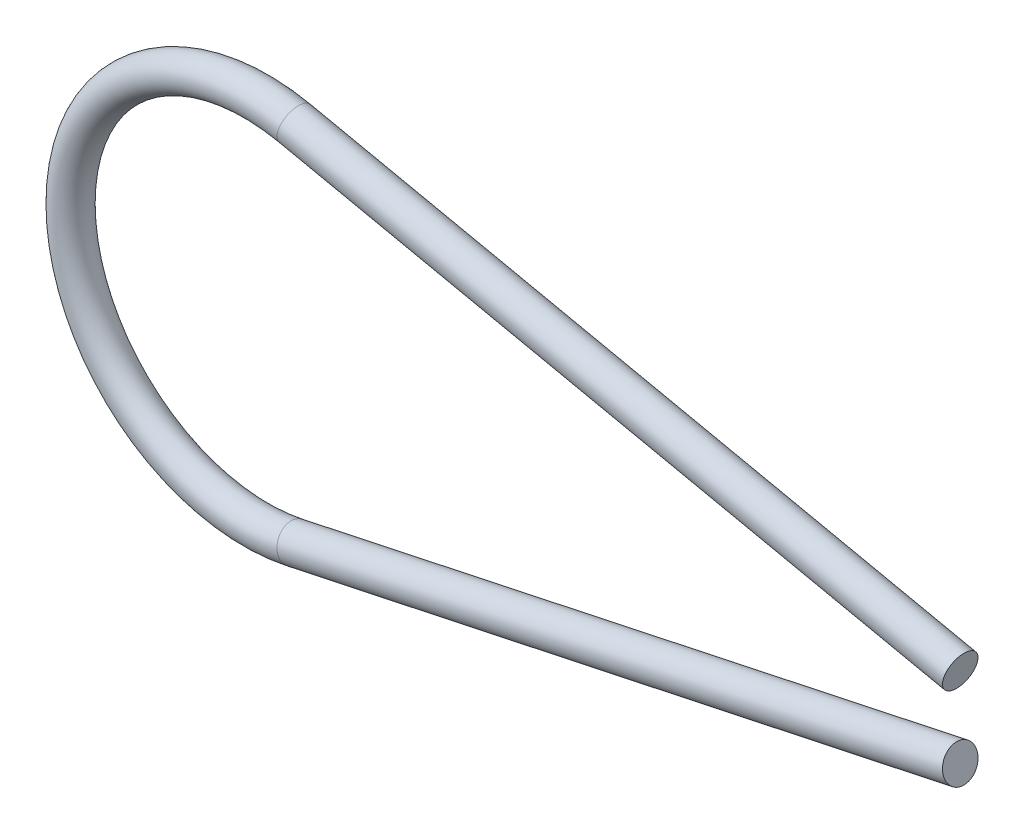
ISO-10303-21;
HEADER;
FILE_DESCRIPTION(('STEP AP214'),'2;1');
FILE_NAME('part.step','',(''),(''),'','','');
FILE_SCHEMA(('AUTOMOTIVE_DESIGN { 1 0 10303 214 1 1 1 1 }'));
ENDSEC;
DATA;
#1=APPLICATION_CONTEXT('core data for automotive mechanical design processes');
#2=APPLICATION_PROTOCOL_DEFINITION('international standard','automotive_design',2000,#1);
#3=PRODUCT_CONTEXT('',#1,'mechanical');
#4=PRODUCT('Part','Part','',(#3));
#5=PRODUCT_RELATED_PRODUCT_CATEGORY('part','',(#4));
#6=PRODUCT_DEFINITION_FORMATION('','',#4);
#7=PRODUCT_DEFINITION_CONTEXT('part definition',#1,'design');
#8=PRODUCT_DEFINITION('design','',#6,#7);
#9=PRODUCT_DEFINITION_SHAPE('','',#8);
#10=(LENGTH_UNIT() NAMED_UNIT(*) SI_UNIT(.MILLI.,.METRE.));
#11=(NAMED_UNIT(*) PLANE_ANGLE_UNIT() SI_UNIT($,.RADIAN.));
#12=(NAMED_UNIT(*) SI_UNIT($,.STERADIAN.) SOLID_ANGLE_UNIT());
#13=UNCERTAINTY_MEASURE_WITH_UNIT(LENGTH_MEASURE(1.E-05),#10,'distance_accuracy_value','');
#14=(GEOMETRIC_REPRESENTATION_CONTEXT(3) GLOBAL_UNCERTAINTY_ASSIGNED_CONTEXT((#13)) GLOBAL_UNIT_ASSIGNED_CONTEXT((#10,
#11,#12)) REPRESENTATION_CONTEXT('',''));
#15=CARTESIAN_POINT('',(0.,0.,0.));
#16=DIRECTION('',(0.,0.,1.));
#17=DIRECTION('',(1.,0.,0.));
#18=AXIS2_PLACEMENT_3D('',#15,#16,#17);
#19=CARTESIAN_POINT('',(1.9326587053084,-1.56503616117409,0.));
#20=DIRECTION('',(0.978147600733807,0.207911690817753,0.));
#21=DIRECTION('',(-0.207911690817753,0.978147600733807,0.));
#22=AXIS2_PLACEMENT_3D('',#19,#20,#21);
#23=CYLINDRICAL_SURFACE('',#22,0.15);
#24=CARTESIAN_POINT('',(1.9326587053084,-1.56503616117409,0.));
#25=DIRECTION('',(0.978147600733807,0.207911690817753,0.));
#26=DIRECTION('',(-0.207911690817753,0.978147600733807,0.));
#27=AXIS2_PLACEMENT_3D('',#24,#25,#26);
#28=CIRCLE('',#27,0.15);
#29=CARTESIAN_POINT('',(1.96384545893107,-1.71175830128416,0.));
#30=VERTEX_POINT('',#29);
#31=EDGE_CURVE('E21',#30,#30,#28,.T.);
#32=ORIENTED_EDGE('',*,*,#31,.T.);
#33=EDGE_LOOP('',(#32));
#34=FACE_BOUND('',#33,.T.);
#35=CARTESIAN_POINT('',(7.67,-0.345526622447055,0.));
#36=DIRECTION('',(0.978147600733807,0.207911690817753,0.));
#37=DIRECTION('',(-0.207911690817753,0.978147600733807,0.));
#38=AXIS2_PLACEMENT_3D('',#35,#36,#37);
#39=CIRCLE('',#38,0.15);
#40=CARTESIAN_POINT('',(7.63881324637733,-0.198804482336984,0.));
#41=VERTEX_POINT('',#40);
#42=EDGE_CURVE('E10',#41,#41,#39,.T.);
#43=ORIENTED_EDGE('',*,*,#42,.F.);
#44=EDGE_LOOP('',(#43));
#45=FACE_BOUND('',#44,.T.);
#46=ADVANCED_FACE('F15',(#34,#45),#23,.T.);
#47=CARTESIAN_POINT('',(1.6,0.,0.));
#48=DIRECTION('',(0.,0.,1.));
#49=DIRECTION('',(1.,0.,0.));
#50=AXIS2_PLACEMENT_3D('',#47,#48,#49);
#51=TOROIDAL_SURFACE('',#50,1.6,0.15);
#52=CARTESIAN_POINT('',(1.93265870530841,1.56503616117409,0.));
#53=DIRECTION('',(-0.978147600733807,0.207911690817753,0.));
#54=DIRECTION('',(-0.207911690817753,-0.978147600733807,0.));
#55=AXIS2_PLACEMENT_3D('',#52,#53,#54);
#56=CIRCLE('',#55,0.15);
#57=CARTESIAN_POINT('',(1.96384545893107,1.71175830128416,0.));
#58=VERTEX_POINT('',#57);
#59=EDGE_CURVE('E25',#58,#58,#56,.T.);
#60=CARTESIAN_POINT('',(1.6,0.,0.));
#61=DIRECTION('',(0.,0.,1.));
#62=DIRECTION('',(1.,0.,0.));
#63=AXIS2_PLACEMENT_3D('',#60,#61,#62);
#64=CIRCLE('',#63,1.75);
#65=EDGE_CURVE('',#58,#30,#64,.T.);
#66=ORIENTED_EDGE('',*,*,#59,.T.);
#67=ORIENTED_EDGE('',*,*,#31,.F.);
#68=ORIENTED_EDGE('',*,*,#65,.T.);
#69=ORIENTED_EDGE('',*,*,#65,.F.);
#70=EDGE_LOOP('',(#66,#68,#67,#69));
#71=FACE_BOUND('',#70,.T.);
#72=ADVANCED_FACE('F49',(#71),#51,.T.);
#73=CARTESIAN_POINT('',(1.93265870530841,1.56503616117409,0.));
#74=DIRECTION('',(0.978147600733807,-0.207911690817753,0.));
#75=DIRECTION('',(0.207911690817753,0.978147600733807,0.));
#76=AXIS2_PLACEMENT_3D('',#73,#74,#75);
#77=CYLINDRICAL_SURFACE('',#76,0.15);
#78=ORIENTED_EDGE('',*,*,#59,.F.);
#79=EDGE_LOOP('',(#78));
#80=FACE_BOUND('',#79,.T.);
#81=CARTESIAN_POINT('',(7.67,0.345526622447054,0.));
#82=DIRECTION('',(-0.978147600733807,0.207911690817753,0.));
#83=DIRECTION('',(-0.207911690817753,-0.978147600733807,0.));
#84=AXIS2_PLACEMENT_3D('',#81,#82,#83);
#85=CIRCLE('',#84,0.15);
#86=CARTESIAN_POINT('',(7.63881324637734,0.198804482336983,0.));
#87=VERTEX_POINT('',#86);
#88=EDGE_CURVE('E29',#87,#87,#85,.T.);
#89=ORIENTED_EDGE('',*,*,#88,.T.);
#90=EDGE_LOOP('',(#89));
#91=FACE_BOUND('',#90,.T.);
#92=ADVANCED_FACE('F35',(#80,#91),#77,.T.);
#93=CARTESIAN_POINT('',(7.67,-0.345526622447055,0.));
#94=DIRECTION('',(0.978147600733807,0.207911690817753,0.));
#95=DIRECTION('',(-0.207911690817753,0.978147600733807,0.));
#96=AXIS2_PLACEMENT_3D('',#93,#94,#95);
#97=PLANE('',#96);
#98=ORIENTED_EDGE('',*,*,#42,.T.);
#99=EDGE_LOOP('',(#98));
#100=FACE_BOUND('',#99,.T.);
#101=ADVANCED_FACE('F39',(#100),#97,.T.);
#102=CARTESIAN_POINT('',(7.67,0.345526622447054,0.));
#103=DIRECTION('',(-0.978147600733807,0.207911690817753,0.));
#104=DIRECTION('',(-0.207911690817753,-0.978147600733807,0.));
#105=AXIS2_PLACEMENT_3D('',#102,#103,#104);
#106=PLANE('',#105);
#107=ORIENTED_EDGE('',*,*,#88,.F.);
#108=EDGE_LOOP('',(#107));
#109=FACE_BOUND('',#108,.T.);
#110=ADVANCED_FACE('F37',(#109),#106,.F.);
#111=CLOSED_SHELL('',(#46,#72,#92,#101,#110));
#112=MANIFOLD_SOLID_BREP('B1',#111);
#113=ADVANCED_BREP_SHAPE_REPRESENTATION('',(#18,#112),#14);
#114=SHAPE_DEFINITION_REPRESENTATION(#9,#113);
ENDSEC;
END-ISO-10303-21;
